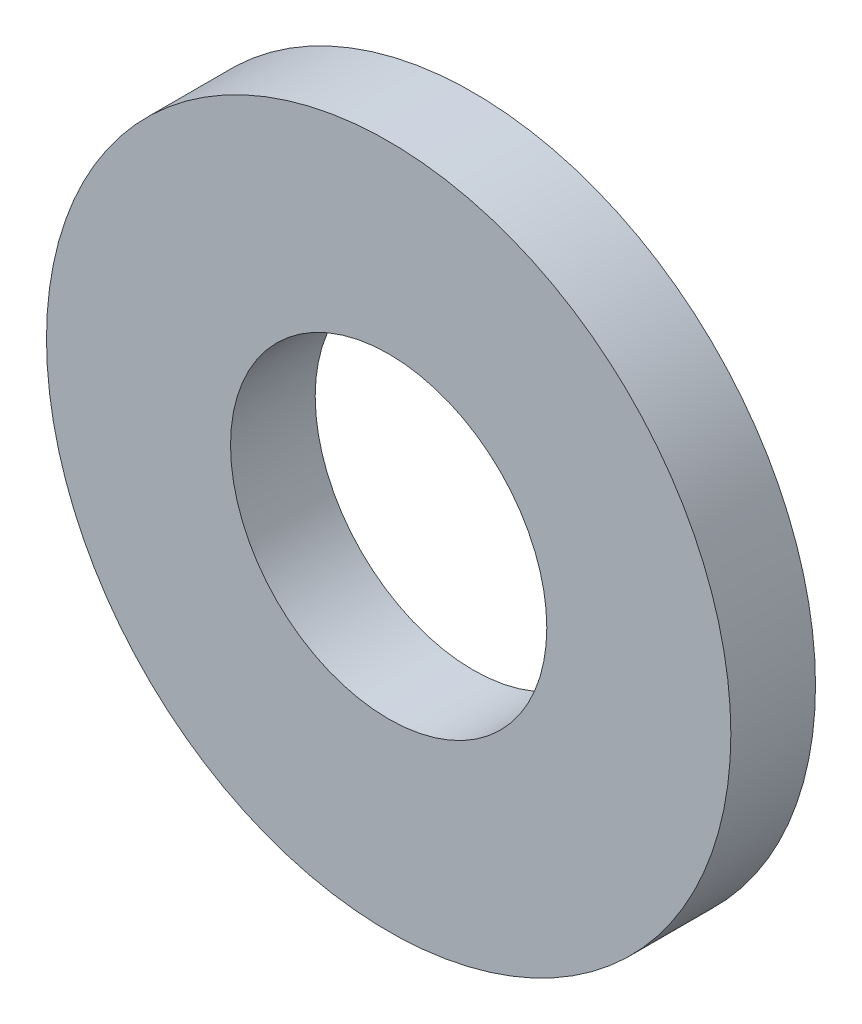
ISO-10303-21;
HEADER;
FILE_DESCRIPTION(('STEP AP214'),'2;1');
FILE_NAME('part.step','',(''),(''),'','','');
FILE_SCHEMA(('AUTOMOTIVE_DESIGN { 1 0 10303 214 1 1 1 1 }'));
ENDSEC;
DATA;
#1=APPLICATION_CONTEXT('core data for automotive mechanical design processes');
#2=APPLICATION_PROTOCOL_DEFINITION('international standard','automotive_design',2000,#1);
#3=PRODUCT_CONTEXT('',#1,'mechanical');
#4=PRODUCT('Part','Part','',(#3));
#5=PRODUCT_RELATED_PRODUCT_CATEGORY('part','',(#4));
#6=PRODUCT_DEFINITION_FORMATION('','',#4);
#7=PRODUCT_DEFINITION_CONTEXT('part definition',#1,'design');
#8=PRODUCT_DEFINITION('design','',#6,#7);
#9=PRODUCT_DEFINITION_SHAPE('','',#8);
#10=(LENGTH_UNIT() NAMED_UNIT(*) SI_UNIT(.MILLI.,.METRE.));
#11=(NAMED_UNIT(*) PLANE_ANGLE_UNIT() SI_UNIT($,.RADIAN.));
#12=(NAMED_UNIT(*) SI_UNIT($,.STERADIAN.) SOLID_ANGLE_UNIT());
#13=UNCERTAINTY_MEASURE_WITH_UNIT(LENGTH_MEASURE(1.E-05),#10,'distance_accuracy_value','');
#14=(GEOMETRIC_REPRESENTATION_CONTEXT(3) GLOBAL_UNCERTAINTY_ASSIGNED_CONTEXT((#13)) GLOBAL_UNIT_ASSIGNED_CONTEXT((#10,
#11,#12)) REPRESENTATION_CONTEXT('',''));
#15=CARTESIAN_POINT('',(0.,0.,0.));
#16=DIRECTION('',(0.,0.,1.));
#17=DIRECTION('',(1.,0.,0.));
#18=AXIS2_PLACEMENT_3D('',#15,#16,#17);
#19=CARTESIAN_POINT('',(0.,0.,5.842));
#20=DIRECTION('',(0.,0.,1.));
#21=DIRECTION('',(1.,0.,0.));
#22=AXIS2_PLACEMENT_3D('',#19,#20,#21);
#23=PLANE('',#22);
#24=CARTESIAN_POINT('',(0.,0.,5.842));
#25=DIRECTION('',(0.,0.,1.));
#26=DIRECTION('',(1.,0.,0.));
#27=AXIS2_PLACEMENT_3D('',#24,#25,#26);
#28=CIRCLE('',#27,23.612475);
#29=CARTESIAN_POINT('',(23.612475,0.,5.842));
#30=VERTEX_POINT('',#29);
#31=EDGE_CURVE('E11',#30,#30,#28,.T.);
#32=ORIENTED_EDGE('',*,*,#31,.T.);
#33=EDGE_LOOP('',(#32));
#34=FACE_BOUND('',#33,.T.);
#35=CARTESIAN_POINT('',(0.,0.,5.842));
#36=DIRECTION('',(0.,0.,1.));
#37=DIRECTION('',(1.,0.,0.));
#38=AXIS2_PLACEMENT_3D('',#35,#36,#37);
#39=CIRCLE('',#38,10.912475);
#40=CARTESIAN_POINT('',(10.912475,0.,5.842));
#41=VERTEX_POINT('',#40);
#42=EDGE_CURVE('E47',#41,#41,#39,.T.);
#43=ORIENTED_EDGE('',*,*,#42,.F.);
#44=EDGE_LOOP('',(#43));
#45=FACE_BOUND('',#44,.T.);
#46=ADVANCED_FACE('F34',(#34,#45),#23,.T.);
#47=CARTESIAN_POINT('',(0.,0.,0.));
#48=DIRECTION('',(0.,0.,1.));
#49=DIRECTION('',(1.,0.,0.));
#50=AXIS2_PLACEMENT_3D('',#47,#48,#49);
#51=PLANE('',#50);
#52=CARTESIAN_POINT('',(0.,0.,0.));
#53=DIRECTION('',(0.,0.,1.));
#54=DIRECTION('',(1.,0.,0.));
#55=AXIS2_PLACEMENT_3D('',#52,#53,#54);
#56=CIRCLE('',#55,23.612475);
#57=CARTESIAN_POINT('',(23.612475,0.,0.));
#58=VERTEX_POINT('',#57);
#59=EDGE_CURVE('E38',#58,#58,#56,.T.);
#60=ORIENTED_EDGE('',*,*,#59,.F.);
#61=EDGE_LOOP('',(#60));
#62=FACE_BOUND('',#61,.T.);
#63=CARTESIAN_POINT('',(0.,0.,0.));
#64=DIRECTION('',(0.,0.,1.));
#65=DIRECTION('',(1.,0.,0.));
#66=AXIS2_PLACEMENT_3D('',#63,#64,#65);
#67=CIRCLE('',#66,10.912475);
#68=CARTESIAN_POINT('',(10.912475,0.,0.));
#69=VERTEX_POINT('',#68);
#70=EDGE_CURVE('E50',#69,#69,#67,.T.);
#71=ORIENTED_EDGE('',*,*,#70,.T.);
#72=EDGE_LOOP('',(#71));
#73=FACE_BOUND('',#72,.T.);
#74=ADVANCED_FACE('F60',(#62,#73),#51,.F.);
#75=CARTESIAN_POINT('',(0.,0.,5.842));
#76=DIRECTION('',(0.,0.,-1.));
#77=DIRECTION('',(-1.,0.,0.));
#78=AXIS2_PLACEMENT_3D('',#75,#76,#77);
#79=CYLINDRICAL_SURFACE('',#78,23.612475);
#80=ORIENTED_EDGE('',*,*,#31,.F.);
#81=EDGE_LOOP('',(#80));
#82=FACE_BOUND('',#81,.T.);
#83=ORIENTED_EDGE('',*,*,#59,.T.);
#84=EDGE_LOOP('',(#83));
#85=FACE_BOUND('',#84,.T.);
#86=ADVANCED_FACE('F36',(#82,#85),#79,.T.);
#87=CARTESIAN_POINT('',(0.,0.,5.842));
#88=DIRECTION('',(0.,0.,-1.));
#89=DIRECTION('',(-1.,0.,0.));
#90=AXIS2_PLACEMENT_3D('',#87,#88,#89);
#91=CYLINDRICAL_SURFACE('',#90,10.912475);
#92=ORIENTED_EDGE('',*,*,#42,.T.);
#93=EDGE_LOOP('',(#92));
#94=FACE_BOUND('',#93,.T.);
#95=ORIENTED_EDGE('',*,*,#70,.F.);
#96=EDGE_LOOP('',(#95));
#97=FACE_BOUND('',#96,.T.);
#98=ADVANCED_FACE('F56',(#94,#97),#91,.F.);
#99=CLOSED_SHELL('',(#46,#74,#86,#98));
#100=MANIFOLD_SOLID_BREP('B2',#99);
#101=ADVANCED_BREP_SHAPE_REPRESENTATION('',(#18,#100),#14);
#102=SHAPE_DEFINITION_REPRESENTATION(#9,#101);
ENDSEC;
END-ISO-10303-21;
